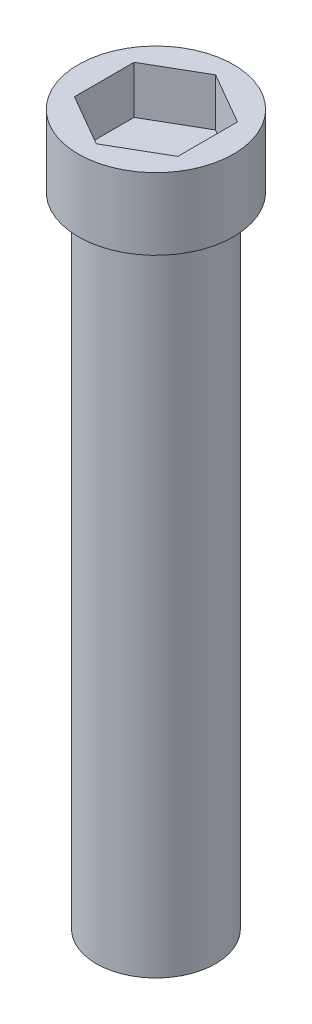
ISO-10303-21;
HEADER;
FILE_DESCRIPTION(('STEP AP214'),'2;1');
FILE_NAME('part.step','',(''),(''),'','','');
FILE_SCHEMA(('AUTOMOTIVE_DESIGN { 1 0 10303 214 1 1 1 1 }'));
ENDSEC;
DATA;
#1=APPLICATION_CONTEXT('core data for automotive mechanical design processes');
#2=APPLICATION_PROTOCOL_DEFINITION('international standard','automotive_design',2000,#1);
#3=PRODUCT_CONTEXT('',#1,'mechanical');
#4=PRODUCT('Part','Part','',(#3));
#5=PRODUCT_RELATED_PRODUCT_CATEGORY('part','',(#4));
#6=PRODUCT_DEFINITION_FORMATION('','',#4);
#7=PRODUCT_DEFINITION_CONTEXT('part definition',#1,'design');
#8=PRODUCT_DEFINITION('design','',#6,#7);
#9=PRODUCT_DEFINITION_SHAPE('','',#8);
#10=(LENGTH_UNIT() NAMED_UNIT(*) SI_UNIT(.MILLI.,.METRE.));
#11=(NAMED_UNIT(*) PLANE_ANGLE_UNIT() SI_UNIT($,.RADIAN.));
#12=(NAMED_UNIT(*) SI_UNIT($,.STERADIAN.) SOLID_ANGLE_UNIT());
#13=UNCERTAINTY_MEASURE_WITH_UNIT(LENGTH_MEASURE(1.E-05),#10,'distance_accuracy_value','');
#14=(GEOMETRIC_REPRESENTATION_CONTEXT(3) GLOBAL_UNCERTAINTY_ASSIGNED_CONTEXT((#13)) GLOBAL_UNIT_ASSIGNED_CONTEXT((#10,
#11,#12)) REPRESENTATION_CONTEXT('',''));
#15=CARTESIAN_POINT('',(0.,0.,0.));
#16=DIRECTION('',(0.,0.,1.));
#17=DIRECTION('',(1.,0.,0.));
#18=AXIS2_PLACEMENT_3D('',#15,#16,#17);
#19=CARTESIAN_POINT('',(0.,26.75,0.));
#20=DIRECTION('',(0.,-1.,0.));
#21=DIRECTION('',(0.,0.,-1.));
#22=AXIS2_PLACEMENT_3D('',#19,#20,#21);
#23=CYLINDRICAL_SURFACE('',#22,2.5);
#24=CARTESIAN_POINT('',(0.,26.75,0.));
#25=DIRECTION('',(0.,1.,0.));
#26=DIRECTION('',(0.,0.,1.));
#27=AXIS2_PLACEMENT_3D('',#24,#25,#26);
#28=CIRCLE('',#27,2.5);
#29=CARTESIAN_POINT('',(0.,26.75,2.5));
#30=VERTEX_POINT('',#29);
#31=EDGE_CURVE('E11',#30,#30,#28,.T.);
#32=ORIENTED_EDGE('',*,*,#31,.F.);
#33=EDGE_LOOP('',(#32));
#34=FACE_BOUND('',#33,.T.);
#35=CARTESIAN_POINT('',(0.,0.,0.));
#36=DIRECTION('',(0.,1.,0.));
#37=DIRECTION('',(0.,0.,1.));
#38=AXIS2_PLACEMENT_3D('',#35,#36,#37);
#39=CIRCLE('',#38,2.5);
#40=CARTESIAN_POINT('',(0.,0.,2.5));
#41=VERTEX_POINT('',#40);
#42=EDGE_CURVE('E42',#41,#41,#39,.T.);
#43=ORIENTED_EDGE('',*,*,#42,.T.);
#44=EDGE_LOOP('',(#43));
#45=FACE_BOUND('',#44,.T.);
#46=ADVANCED_FACE('F39',(#34,#45),#23,.T.);
#47=CARTESIAN_POINT('',(0.,0.,0.));
#48=DIRECTION('',(0.,1.,0.));
#49=DIRECTION('',(0.,0.,1.));
#50=AXIS2_PLACEMENT_3D('',#47,#48,#49);
#51=PLANE('',#50);
#52=ORIENTED_EDGE('',*,*,#42,.F.);
#53=EDGE_LOOP('',(#52));
#54=FACE_BOUND('',#53,.T.);
#55=ADVANCED_FACE('F171',(#54),#51,.F.);
#56=CARTESIAN_POINT('',(0.,29.75,0.));
#57=DIRECTION('',(0.,-1.,0.));
#58=DIRECTION('',(0.,0.,-1.));
#59=AXIS2_PLACEMENT_3D('',#56,#57,#58);
#60=CYLINDRICAL_SURFACE('',#59,3.25);
#61=CARTESIAN_POINT('',(0.,29.75,0.));
#62=DIRECTION('',(0.,1.,0.));
#63=DIRECTION('',(0.,0.,1.));
#64=AXIS2_PLACEMENT_3D('',#61,#62,#63);
#65=CIRCLE('',#64,3.25);
#66=CARTESIAN_POINT('',(0.,29.75,3.25));
#67=VERTEX_POINT('',#66);
#68=EDGE_CURVE('E146',#67,#67,#65,.T.);
#69=ORIENTED_EDGE('',*,*,#68,.F.);
#70=EDGE_LOOP('',(#69));
#71=FACE_BOUND('',#70,.T.);
#72=CARTESIAN_POINT('',(0.,26.75,0.));
#73=DIRECTION('',(0.,1.,0.));
#74=DIRECTION('',(0.,0.,1.));
#75=AXIS2_PLACEMENT_3D('',#72,#73,#74);
#76=CIRCLE('',#75,3.25);
#77=CARTESIAN_POINT('',(0.,26.75,3.25));
#78=VERTEX_POINT('',#77);
#79=EDGE_CURVE('E140',#78,#78,#76,.T.);
#80=ORIENTED_EDGE('',*,*,#79,.T.);
#81=EDGE_LOOP('',(#80));
#82=FACE_BOUND('',#81,.T.);
#83=ADVANCED_FACE('F152',(#71,#82),#60,.T.);
#84=CARTESIAN_POINT('',(0.,29.75,0.));
#85=DIRECTION('',(0.,1.,0.));
#86=DIRECTION('',(0.,0.,1.));
#87=AXIS2_PLACEMENT_3D('',#84,#85,#86);
#88=PLANE('',#87);
#89=DIRECTION('',(-0.866025403784439,0.,-0.5));
#90=VECTOR('',#89,1.);
#91=CARTESIAN_POINT('',(2.1650635094611,29.75,-1.25));
#92=LINE('',#91,#90);
#93=CARTESIAN_POINT('',(2.1650635094611,29.75,-1.25));
#94=VERTEX_POINT('',#93);
#95=CARTESIAN_POINT('',(0.,29.75,-2.5));
#96=VERTEX_POINT('',#95);
#97=EDGE_CURVE('E53',#94,#96,#92,.T.);
#98=ORIENTED_EDGE('',*,*,#97,.F.);
#99=DIRECTION('',(0.,0.,-1.));
#100=VECTOR('',#99,1.);
#101=CARTESIAN_POINT('',(2.1650635094611,29.75,1.25));
#102=LINE('',#101,#100);
#103=CARTESIAN_POINT('',(2.1650635094611,29.75,1.25));
#104=VERTEX_POINT('',#103);
#105=EDGE_CURVE('E136',#104,#94,#102,.T.);
#106=ORIENTED_EDGE('',*,*,#105,.F.);
#107=DIRECTION('',(0.866025403784439,0.,-0.5));
#108=VECTOR('',#107,1.);
#109=CARTESIAN_POINT('',(0.,29.75,2.5));
#110=LINE('',#109,#108);
#111=CARTESIAN_POINT('',(0.,29.75,2.5));
#112=VERTEX_POINT('',#111);
#113=EDGE_CURVE('E134',#112,#104,#110,.T.);
#114=ORIENTED_EDGE('',*,*,#113,.F.);
#115=DIRECTION('',(0.866025403784439,0.,0.5));
#116=VECTOR('',#115,1.);
#117=CARTESIAN_POINT('',(-2.1650635094611,29.75,1.25));
#118=LINE('',#117,#116);
#119=CARTESIAN_POINT('',(-2.1650635094611,29.75,1.25));
#120=VERTEX_POINT('',#119);
#121=EDGE_CURVE('E101',#120,#112,#118,.T.);
#122=ORIENTED_EDGE('',*,*,#121,.F.);
#123=DIRECTION('',(0.,0.,1.));
#124=VECTOR('',#123,1.);
#125=CARTESIAN_POINT('',(-2.1650635094611,29.75,-1.25));
#126=LINE('',#125,#124);
#127=CARTESIAN_POINT('',(-2.1650635094611,29.75,-1.25));
#128=VERTEX_POINT('',#127);
#129=EDGE_CURVE('E130',#128,#120,#126,.T.);
#130=ORIENTED_EDGE('',*,*,#129,.F.);
#131=DIRECTION('',(-0.866025403784439,0.,0.5));
#132=VECTOR('',#131,1.);
#133=CARTESIAN_POINT('',(0.,29.75,-2.5));
#134=LINE('',#133,#132);
#135=EDGE_CURVE('E127',#96,#128,#134,.T.);
#136=ORIENTED_EDGE('',*,*,#135,.F.);
#137=EDGE_LOOP('',(#98,#106,#114,#122,#130,#136));
#138=FACE_BOUND('',#137,.T.);
#139=ORIENTED_EDGE('',*,*,#68,.T.);
#140=EDGE_LOOP('',(#139));
#141=FACE_BOUND('',#140,.T.);
#142=ADVANCED_FACE('F157',(#138,#141),#88,.T.);
#143=CARTESIAN_POINT('',(0.,26.75,0.));
#144=DIRECTION('',(0.,1.,0.));
#145=DIRECTION('',(0.,0.,1.));
#146=AXIS2_PLACEMENT_3D('',#143,#144,#145);
#147=PLANE('',#146);
#148=ORIENTED_EDGE('',*,*,#31,.T.);
#149=EDGE_LOOP('',(#148));
#150=FACE_BOUND('',#149,.T.);
#151=ORIENTED_EDGE('',*,*,#79,.F.);
#152=EDGE_LOOP('',(#151));
#153=FACE_BOUND('',#152,.T.);
#154=ADVANCED_FACE('F154',(#150,#153),#147,.F.);
#155=CARTESIAN_POINT('',(2.1650635094611,27.75,-1.25));
#156=DIRECTION('',(0.5,0.,-0.866025403784439));
#157=DIRECTION('',(-0.866025403784439,0.,-0.5));
#158=AXIS2_PLACEMENT_3D('',#155,#156,#157);
#159=PLANE('',#158);
#160=ORIENTED_EDGE('',*,*,#97,.T.);
#161=DIRECTION('',(0.,1.,0.));
#162=VECTOR('',#161,1.);
#163=CARTESIAN_POINT('',(0.,27.75,-2.5));
#164=LINE('',#163,#162);
#165=CARTESIAN_POINT('',(0.,27.75,-2.5));
#166=VERTEX_POINT('',#165);
#167=EDGE_CURVE('E83',#166,#96,#164,.T.);
#168=ORIENTED_EDGE('',*,*,#167,.F.);
#169=DIRECTION('',(-0.866025403784439,0.,-0.5));
#170=VECTOR('',#169,1.);
#171=CARTESIAN_POINT('',(2.1650635094611,27.75,-1.25));
#172=LINE('',#171,#170);
#173=CARTESIAN_POINT('',(2.1650635094611,27.75,-1.25));
#174=VERTEX_POINT('',#173);
#175=EDGE_CURVE('E138',#174,#166,#172,.T.);
#176=ORIENTED_EDGE('',*,*,#175,.F.);
#177=DIRECTION('',(0.,1.,0.));
#178=VECTOR('',#177,1.);
#179=CARTESIAN_POINT('',(2.1650635094611,27.75,-1.25));
#180=LINE('',#179,#178);
#181=EDGE_CURVE('E61',#174,#94,#180,.T.);
#182=ORIENTED_EDGE('',*,*,#181,.T.);
#183=EDGE_LOOP('',(#160,#168,#176,#182));
#184=FACE_BOUND('',#183,.T.);
#185=ADVANCED_FACE('F156',(#184),#159,.F.);
#186=CARTESIAN_POINT('',(2.1650635094611,27.75,1.25));
#187=DIRECTION('',(1.,0.,0.));
#188=DIRECTION('',(0.,0.,-1.));
#189=AXIS2_PLACEMENT_3D('',#186,#187,#188);
#190=PLANE('',#189);
#191=ORIENTED_EDGE('',*,*,#105,.T.);
#192=ORIENTED_EDGE('',*,*,#181,.F.);
#193=DIRECTION('',(0.,0.,-1.));
#194=VECTOR('',#193,1.);
#195=CARTESIAN_POINT('',(2.1650635094611,27.75,1.25));
#196=LINE('',#195,#194);
#197=CARTESIAN_POINT('',(2.1650635094611,27.75,1.25));
#198=VERTEX_POINT('',#197);
#199=EDGE_CURVE('E113',#198,#174,#196,.T.);
#200=ORIENTED_EDGE('',*,*,#199,.F.);
#201=DIRECTION('',(0.,1.,0.));
#202=VECTOR('',#201,1.);
#203=CARTESIAN_POINT('',(2.1650635094611,27.75,1.25));
#204=LINE('',#203,#202);
#205=EDGE_CURVE('E105',#198,#104,#204,.T.);
#206=ORIENTED_EDGE('',*,*,#205,.T.);
#207=EDGE_LOOP('',(#191,#192,#200,#206));
#208=FACE_BOUND('',#207,.T.);
#209=ADVANCED_FACE('F165',(#208),#190,.F.);
#210=CARTESIAN_POINT('',(0.,27.75,2.5));
#211=DIRECTION('',(0.5,0.,0.866025403784439));
#212=DIRECTION('',(0.866025403784439,0.,-0.5));
#213=AXIS2_PLACEMENT_3D('',#210,#211,#212);
#214=PLANE('',#213);
#215=ORIENTED_EDGE('',*,*,#113,.T.);
#216=ORIENTED_EDGE('',*,*,#205,.F.);
#217=DIRECTION('',(0.866025403784439,0.,-0.5));
#218=VECTOR('',#217,1.);
#219=CARTESIAN_POINT('',(0.,27.75,2.5));
#220=LINE('',#219,#218);
#221=CARTESIAN_POINT('',(0.,27.75,2.5));
#222=VERTEX_POINT('',#221);
#223=EDGE_CURVE('E109',#222,#198,#220,.T.);
#224=ORIENTED_EDGE('',*,*,#223,.F.);
#225=DIRECTION('',(0.,1.,0.));
#226=VECTOR('',#225,1.);
#227=CARTESIAN_POINT('',(0.,27.75,2.5));
#228=LINE('',#227,#226);
#229=EDGE_CURVE('E94',#222,#112,#228,.T.);
#230=ORIENTED_EDGE('',*,*,#229,.T.);
#231=EDGE_LOOP('',(#215,#216,#224,#230));
#232=FACE_BOUND('',#231,.T.);
#233=ADVANCED_FACE('F110',(#232),#214,.F.);
#234=CARTESIAN_POINT('',(-2.1650635094611,27.75,1.25));
#235=DIRECTION('',(-0.5,0.,0.866025403784439));
#236=DIRECTION('',(0.866025403784439,0.,0.5));
#237=AXIS2_PLACEMENT_3D('',#234,#235,#236);
#238=PLANE('',#237);
#239=ORIENTED_EDGE('',*,*,#121,.T.);
#240=ORIENTED_EDGE('',*,*,#229,.F.);
#241=DIRECTION('',(0.866025403784439,0.,0.5));
#242=VECTOR('',#241,1.);
#243=CARTESIAN_POINT('',(-2.1650635094611,27.75,1.25));
#244=LINE('',#243,#242);
#245=CARTESIAN_POINT('',(-2.1650635094611,27.75,1.25));
#246=VERTEX_POINT('',#245);
#247=EDGE_CURVE('E98',#246,#222,#244,.T.);
#248=ORIENTED_EDGE('',*,*,#247,.F.);
#249=DIRECTION('',(0.,1.,0.));
#250=VECTOR('',#249,1.);
#251=CARTESIAN_POINT('',(-2.1650635094611,27.75,1.25));
#252=LINE('',#251,#250);
#253=EDGE_CURVE('E106',#246,#120,#252,.T.);
#254=ORIENTED_EDGE('',*,*,#253,.T.);
#255=EDGE_LOOP('',(#239,#240,#248,#254));
#256=FACE_BOUND('',#255,.T.);
#257=ADVANCED_FACE('F96',(#256),#238,.F.);
#258=CARTESIAN_POINT('',(-2.1650635094611,27.75,-1.25));
#259=DIRECTION('',(-1.,0.,0.));
#260=DIRECTION('',(0.,0.,1.));
#261=AXIS2_PLACEMENT_3D('',#258,#259,#260);
#262=PLANE('',#261);
#263=ORIENTED_EDGE('',*,*,#129,.T.);
#264=ORIENTED_EDGE('',*,*,#253,.F.);
#265=DIRECTION('',(0.,0.,1.));
#266=VECTOR('',#265,1.);
#267=CARTESIAN_POINT('',(-2.1650635094611,27.75,-1.25));
#268=LINE('',#267,#266);
#269=CARTESIAN_POINT('',(-2.1650635094611,27.75,-1.25));
#270=VERTEX_POINT('',#269);
#271=EDGE_CURVE('E119',#270,#246,#268,.T.);
#272=ORIENTED_EDGE('',*,*,#271,.F.);
#273=DIRECTION('',(0.,1.,0.));
#274=VECTOR('',#273,1.);
#275=CARTESIAN_POINT('',(-2.1650635094611,27.75,-1.25));
#276=LINE('',#275,#274);
#277=EDGE_CURVE('E143',#270,#128,#276,.T.);
#278=ORIENTED_EDGE('',*,*,#277,.T.);
#279=EDGE_LOOP('',(#263,#264,#272,#278));
#280=FACE_BOUND('',#279,.T.);
#281=ADVANCED_FACE('F233',(#280),#262,.F.);
#282=CARTESIAN_POINT('',(0.,27.75,-2.5));
#283=DIRECTION('',(-0.5,0.,-0.866025403784439));
#284=DIRECTION('',(-0.866025403784439,0.,0.5));
#285=AXIS2_PLACEMENT_3D('',#282,#283,#284);
#286=PLANE('',#285);
#287=ORIENTED_EDGE('',*,*,#135,.T.);
#288=ORIENTED_EDGE('',*,*,#277,.F.);
#289=DIRECTION('',(-0.866025403784439,0.,0.5));
#290=VECTOR('',#289,1.);
#291=CARTESIAN_POINT('',(0.,27.75,-2.5));
#292=LINE('',#291,#290);
#293=EDGE_CURVE('E121',#166,#270,#292,.T.);
#294=ORIENTED_EDGE('',*,*,#293,.F.);
#295=ORIENTED_EDGE('',*,*,#167,.T.);
#296=EDGE_LOOP('',(#287,#288,#294,#295));
#297=FACE_BOUND('',#296,.T.);
#298=ADVANCED_FACE('F242',(#297),#286,.F.);
#299=CARTESIAN_POINT('',(0.,27.75,0.));
#300=DIRECTION('',(0.,1.,0.));
#301=DIRECTION('',(0.,0.,1.));
#302=AXIS2_PLACEMENT_3D('',#299,#300,#301);
#303=PLANE('',#302);
#304=ORIENTED_EDGE('',*,*,#175,.T.);
#305=ORIENTED_EDGE('',*,*,#293,.T.);
#306=ORIENTED_EDGE('',*,*,#271,.T.);
#307=ORIENTED_EDGE('',*,*,#247,.T.);
#308=ORIENTED_EDGE('',*,*,#223,.T.);
#309=ORIENTED_EDGE('',*,*,#199,.T.);
#310=EDGE_LOOP('',(#304,#305,#306,#307,#308,#309));
#311=FACE_BOUND('',#310,.T.);
#312=ADVANCED_FACE('F116',(#311),#303,.T.);
#313=CLOSED_SHELL('',(#46,#55,#83,#142,#154,#185,#209,#233,#257,#281,#298,#312));
#314=MANIFOLD_SOLID_BREP('B2',#313);
#315=ADVANCED_BREP_SHAPE_REPRESENTATION('',(#18,#314),#14);
#316=SHAPE_DEFINITION_REPRESENTATION(#9,#315);
ENDSEC;
END-ISO-10303-21;
